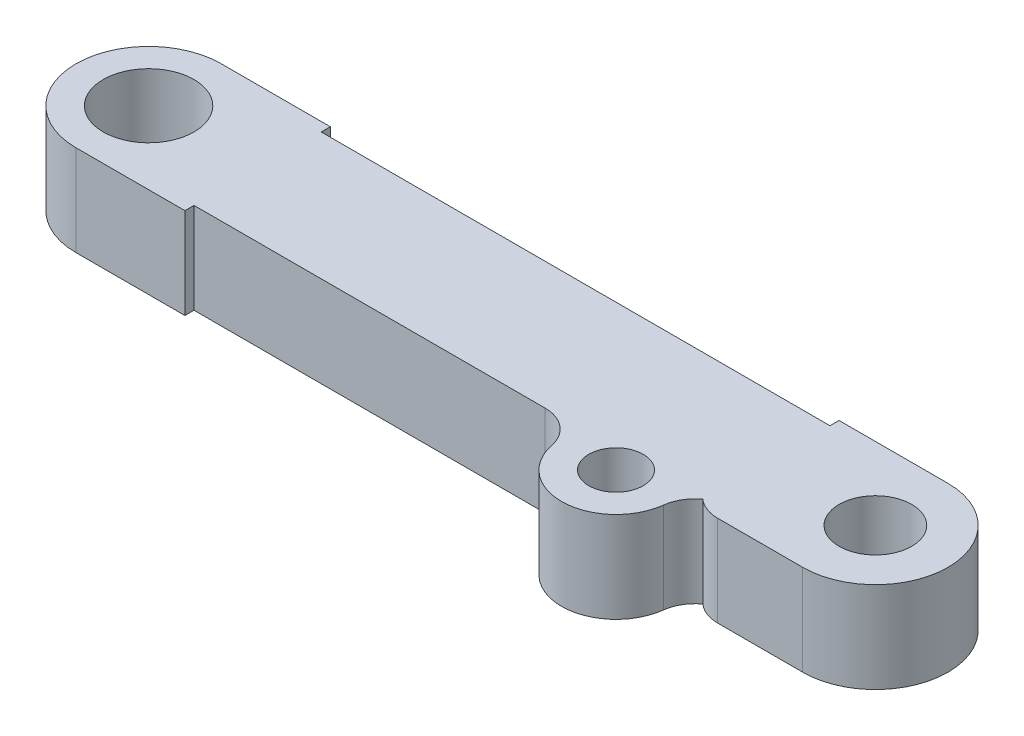
ISO-10303-21;
HEADER;
FILE_DESCRIPTION(('STEP AP214'),'2;1');
FILE_NAME('part.step','',(''),(''),'','','');
FILE_SCHEMA(('AUTOMOTIVE_DESIGN { 1 0 10303 214 1 1 1 1 }'));
ENDSEC;
DATA;
#1=APPLICATION_CONTEXT('core data for automotive mechanical design processes');
#2=APPLICATION_PROTOCOL_DEFINITION('international standard','automotive_design',2000,#1);
#3=PRODUCT_CONTEXT('',#1,'mechanical');
#4=PRODUCT('Part','Part','',(#3));
#5=PRODUCT_RELATED_PRODUCT_CATEGORY('part','',(#4));
#6=PRODUCT_DEFINITION_FORMATION('','',#4);
#7=PRODUCT_DEFINITION_CONTEXT('part definition',#1,'design');
#8=PRODUCT_DEFINITION('design','',#6,#7);
#9=PRODUCT_DEFINITION_SHAPE('','',#8);
#10=(LENGTH_UNIT() NAMED_UNIT(*) SI_UNIT(.MILLI.,.METRE.));
#11=(NAMED_UNIT(*) PLANE_ANGLE_UNIT() SI_UNIT($,.RADIAN.));
#12=(NAMED_UNIT(*) SI_UNIT($,.STERADIAN.) SOLID_ANGLE_UNIT());
#13=UNCERTAINTY_MEASURE_WITH_UNIT(LENGTH_MEASURE(1.E-05),#10,'distance_accuracy_value','');
#14=(GEOMETRIC_REPRESENTATION_CONTEXT(3) GLOBAL_UNCERTAINTY_ASSIGNED_CONTEXT((#13)) GLOBAL_UNIT_ASSIGNED_CONTEXT((#10,
#11,#12)) REPRESENTATION_CONTEXT('',''));
#15=CARTESIAN_POINT('',(0.,0.,0.));
#16=DIRECTION('',(0.,0.,1.));
#17=DIRECTION('',(1.,0.,0.));
#18=AXIS2_PLACEMENT_3D('',#15,#16,#17);
#19=CARTESIAN_POINT('',(0.,100.,0.));
#20=DIRECTION('',(0.,1.,0.));
#21=DIRECTION('',(0.,0.,1.));
#22=AXIS2_PLACEMENT_3D('',#19,#20,#21);
#23=PLANE('',#22);
#24=CARTESIAN_POINT('',(0.,100.,0.));
#25=DIRECTION('',(0.,1.,0.));
#26=DIRECTION('',(0.,0.,1.));
#27=AXIS2_PLACEMENT_3D('',#24,#25,#26);
#28=CIRCLE('',#27,50.);
#29=CARTESIAN_POINT('',(0.,100.,50.));
#30=VERTEX_POINT('',#29);
#31=EDGE_CURVE('E269',#30,#30,#28,.T.);
#32=ORIENTED_EDGE('',*,*,#31,.F.);
#33=EDGE_LOOP('',(#32));
#34=FACE_BOUND('',#33,.T.);
#35=CARTESIAN_POINT('',(703.733155109823,100.,102.198405993668));
#36=DIRECTION('',(0.,1.,0.));
#37=DIRECTION('',(0.,0.,1.));
#38=AXIS2_PLACEMENT_3D('',#35,#36,#37);
#39=CIRCLE('',#38,40.);
#40=CARTESIAN_POINT('',(664.031872730105,100.,97.3190435962007));
#41=VERTEX_POINT('',#40);
#42=CARTESIAN_POINT('',(680.,100.,70.));
#43=VERTEX_POINT('',#42);
#44=EDGE_CURVE('E182',#41,#43,#39,.F.);
#45=ORIENTED_EDGE('',*,*,#44,.T.);
#46=CARTESIAN_POINT('',(706.457513110646,100.,40.));
#47=DIRECTION('',(0.,1.,0.));
#48=DIRECTION('',(0.,0.,1.));
#49=AXIS2_PLACEMENT_3D('',#46,#47,#48);
#50=CIRCLE('',#49,40.);
#51=CARTESIAN_POINT('',(706.457513110646,100.,80.));
#52=VERTEX_POINT('',#51);
#53=EDGE_CURVE('E11',#43,#52,#50,.T.);
#54=ORIENTED_EDGE('',*,*,#53,.T.);
#55=DIRECTION('',(1.,0.,0.));
#56=VECTOR('',#55,1.);
#57=CARTESIAN_POINT('',(680.,100.,80.));
#58=LINE('',#57,#56);
#59=CARTESIAN_POINT('',(800.,100.,80.));
#60=VERTEX_POINT('',#59);
#61=EDGE_CURVE('E257',#52,#60,#58,.T.);
#62=ORIENTED_EDGE('',*,*,#61,.T.);
#63=CARTESIAN_POINT('',(800.,100.,0.));
#64=DIRECTION('',(0.,1.,0.));
#65=DIRECTION('',(0.,0.,1.));
#66=AXIS2_PLACEMENT_3D('',#63,#64,#65);
#67=CIRCLE('',#66,80.);
#68=CARTESIAN_POINT('',(800.,100.,-80.));
#69=VERTEX_POINT('',#68);
#70=EDGE_CURVE('E255',#60,#69,#67,.T.);
#71=ORIENTED_EDGE('',*,*,#70,.T.);
#72=DIRECTION('',(-1.,0.,0.));
#73=VECTOR('',#72,1.);
#74=CARTESIAN_POINT('',(680.,100.,-80.));
#75=LINE('',#74,#73);
#76=CARTESIAN_POINT('',(680.,100.,-80.));
#77=VERTEX_POINT('',#76);
#78=EDGE_CURVE('E253',#69,#77,#75,.T.);
#79=ORIENTED_EDGE('',*,*,#78,.T.);
#80=DIRECTION('',(0.,0.,1.));
#81=VECTOR('',#80,1.);
#82=CARTESIAN_POINT('',(680.,100.,-80.));
#83=LINE('',#82,#81);
#84=CARTESIAN_POINT('',(680.,100.,-70.));
#85=VERTEX_POINT('',#84);
#86=EDGE_CURVE('E251',#77,#85,#83,.T.);
#87=ORIENTED_EDGE('',*,*,#86,.T.);
#88=DIRECTION('',(-1.,0.,0.));
#89=VECTOR('',#88,1.);
#90=CARTESIAN_POINT('',(120.,100.,-70.));
#91=LINE('',#90,#89);
#92=CARTESIAN_POINT('',(120.,100.,-70.));
#93=VERTEX_POINT('',#92);
#94=EDGE_CURVE('E249',#85,#93,#91,.T.);
#95=ORIENTED_EDGE('',*,*,#94,.T.);
#96=DIRECTION('',(0.,0.,-1.));
#97=VECTOR('',#96,1.);
#98=CARTESIAN_POINT('',(120.,100.,-80.));
#99=LINE('',#98,#97);
#100=CARTESIAN_POINT('',(120.,100.,-80.));
#101=VERTEX_POINT('',#100);
#102=EDGE_CURVE('E247',#93,#101,#99,.T.);
#103=ORIENTED_EDGE('',*,*,#102,.T.);
#104=DIRECTION('',(-1.,0.,0.));
#105=VECTOR('',#104,1.);
#106=CARTESIAN_POINT('',(0.,100.,-80.));
#107=LINE('',#106,#105);
#108=CARTESIAN_POINT('',(0.,100.,-80.));
#109=VERTEX_POINT('',#108);
#110=EDGE_CURVE('E155',#101,#109,#107,.T.);
#111=ORIENTED_EDGE('',*,*,#110,.T.);
#112=CARTESIAN_POINT('',(0.,100.,0.));
#113=DIRECTION('',(0.,1.,0.));
#114=DIRECTION('',(0.,0.,1.));
#115=AXIS2_PLACEMENT_3D('',#112,#113,#114);
#116=CIRCLE('',#115,80.);
#117=CARTESIAN_POINT('',(0.,100.,80.));
#118=VERTEX_POINT('',#117);
#119=EDGE_CURVE('E150',#109,#118,#116,.T.);
#120=ORIENTED_EDGE('',*,*,#119,.T.);
#121=DIRECTION('',(1.,0.,0.));
#122=VECTOR('',#121,1.);
#123=CARTESIAN_POINT('',(0.,100.,80.));
#124=LINE('',#123,#122);
#125=CARTESIAN_POINT('',(120.,100.,80.));
#126=VERTEX_POINT('',#125);
#127=EDGE_CURVE('E140',#118,#126,#124,.T.);
#128=ORIENTED_EDGE('',*,*,#127,.T.);
#129=DIRECTION('',(0.,0.,-1.));
#130=VECTOR('',#129,1.);
#131=CARTESIAN_POINT('',(120.,100.,70.));
#132=LINE('',#131,#130);
#133=CARTESIAN_POINT('',(120.,100.,70.));
#134=VERTEX_POINT('',#133);
#135=EDGE_CURVE('E149',#126,#134,#132,.T.);
#136=ORIENTED_EDGE('',*,*,#135,.T.);
#137=DIRECTION('',(1.,0.,0.));
#138=VECTOR('',#137,1.);
#139=CARTESIAN_POINT('',(120.,100.,70.));
#140=LINE('',#139,#138);
#141=CARTESIAN_POINT('',(506.500359449199,100.,70.));
#142=VERTEX_POINT('',#141);
#143=EDGE_CURVE('E262',#134,#142,#140,.T.);
#144=ORIENTED_EDGE('',*,*,#143,.T.);
#145=CARTESIAN_POINT('',(506.500359449199,100.,110.));
#146=DIRECTION('',(0.,1.,0.));
#147=DIRECTION('',(0.,0.,1.));
#148=AXIS2_PLACEMENT_3D('',#145,#146,#147);
#149=CIRCLE('',#148,40.);
#150=CARTESIAN_POINT('',(545.69219533373,100.,102.));
#151=VERTEX_POINT('',#150);
#152=EDGE_CURVE('E176',#142,#151,#149,.F.);
#153=ORIENTED_EDGE('',*,*,#152,.T.);
#154=CARTESIAN_POINT('',(604.479949160526,100.,90.));
#155=DIRECTION('',(0.,1.,0.));
#156=DIRECTION('',(0.,0.,1.));
#157=AXIS2_PLACEMENT_3D('',#154,#155,#156);
#158=CIRCLE('',#157,60.0000000000001);
#159=EDGE_CURVE('E259',#151,#41,#158,.T.);
#160=ORIENTED_EDGE('',*,*,#159,.T.);
#161=EDGE_LOOP('',(#45,#54,#62,#71,#79,#87,#95,#103,#111,#120,#128,#136,#144,#153,#160));
#162=FACE_BOUND('',#161,.T.);
#163=CARTESIAN_POINT('',(604.479949160526,100.,90.));
#164=DIRECTION('',(0.,1.,0.));
#165=DIRECTION('',(0.,0.,1.));
#166=AXIS2_PLACEMENT_3D('',#163,#164,#165);
#167=CIRCLE('',#166,30.);
#168=CARTESIAN_POINT('',(604.479949160526,100.,120.));
#169=VERTEX_POINT('',#168);
#170=EDGE_CURVE('E245',#169,#169,#167,.T.);
#171=ORIENTED_EDGE('',*,*,#170,.F.);
#172=EDGE_LOOP('',(#171));
#173=FACE_BOUND('',#172,.T.);
#174=CARTESIAN_POINT('',(800.,100.,0.));
#175=DIRECTION('',(0.,1.,0.));
#176=DIRECTION('',(0.,0.,1.));
#177=AXIS2_PLACEMENT_3D('',#174,#175,#176);
#178=CIRCLE('',#177,40.);
#179=CARTESIAN_POINT('',(800.,100.,40.));
#180=VERTEX_POINT('',#179);
#181=EDGE_CURVE('E275',#180,#180,#178,.T.);
#182=ORIENTED_EDGE('',*,*,#181,.F.);
#183=EDGE_LOOP('',(#182));
#184=FACE_BOUND('',#183,.T.);
#185=ADVANCED_FACE('F35',(#34,#162,#173,#184),#23,.T.);
#186=CARTESIAN_POINT('',(0.,0.,0.));
#187=DIRECTION('',(0.,1.,0.));
#188=DIRECTION('',(0.,0.,1.));
#189=AXIS2_PLACEMENT_3D('',#186,#187,#188);
#190=PLANE('',#189);
#191=DIRECTION('',(1.,0.,0.));
#192=VECTOR('',#191,1.);
#193=CARTESIAN_POINT('',(680.,0.,80.));
#194=LINE('',#193,#192);
#195=CARTESIAN_POINT('',(706.457513110646,0.,80.));
#196=VERTEX_POINT('',#195);
#197=CARTESIAN_POINT('',(800.,0.,80.));
#198=VERTEX_POINT('',#197);
#199=EDGE_CURVE('E193',#196,#198,#194,.T.);
#200=ORIENTED_EDGE('',*,*,#199,.F.);
#201=CARTESIAN_POINT('',(706.457513110646,0.,40.));
#202=DIRECTION('',(0.,1.,0.));
#203=DIRECTION('',(0.,0.,1.));
#204=AXIS2_PLACEMENT_3D('',#201,#202,#203);
#205=CIRCLE('',#204,40.);
#206=CARTESIAN_POINT('',(680.,0.,70.));
#207=VERTEX_POINT('',#206);
#208=EDGE_CURVE('E43',#196,#207,#205,.F.);
#209=ORIENTED_EDGE('',*,*,#208,.T.);
#210=CARTESIAN_POINT('',(703.733155109823,0.,102.198405993668));
#211=DIRECTION('',(0.,1.,0.));
#212=DIRECTION('',(0.,0.,1.));
#213=AXIS2_PLACEMENT_3D('',#210,#211,#212);
#214=CIRCLE('',#213,40.);
#215=CARTESIAN_POINT('',(664.031872730105,0.,97.3190435962007));
#216=VERTEX_POINT('',#215);
#217=EDGE_CURVE('E180',#207,#216,#214,.T.);
#218=ORIENTED_EDGE('',*,*,#217,.T.);
#219=CARTESIAN_POINT('',(604.479949160526,0.,90.));
#220=DIRECTION('',(0.,1.,0.));
#221=DIRECTION('',(0.,0.,1.));
#222=AXIS2_PLACEMENT_3D('',#219,#220,#221);
#223=CIRCLE('',#222,60.0000000000001);
#224=CARTESIAN_POINT('',(545.69219533373,0.,102.));
#225=VERTEX_POINT('',#224);
#226=EDGE_CURVE('E235',#225,#216,#223,.T.);
#227=ORIENTED_EDGE('',*,*,#226,.F.);
#228=CARTESIAN_POINT('',(506.500359449199,0.,110.));
#229=DIRECTION('',(0.,1.,0.));
#230=DIRECTION('',(0.,0.,1.));
#231=AXIS2_PLACEMENT_3D('',#228,#229,#230);
#232=CIRCLE('',#231,40.);
#233=CARTESIAN_POINT('',(506.500359449199,0.,70.));
#234=VERTEX_POINT('',#233);
#235=EDGE_CURVE('E174',#225,#234,#232,.T.);
#236=ORIENTED_EDGE('',*,*,#235,.T.);
#237=DIRECTION('',(1.,0.,0.));
#238=VECTOR('',#237,1.);
#239=CARTESIAN_POINT('',(120.,0.,70.));
#240=LINE('',#239,#238);
#241=CARTESIAN_POINT('',(120.,0.,70.));
#242=VERTEX_POINT('',#241);
#243=EDGE_CURVE('E237',#242,#234,#240,.T.);
#244=ORIENTED_EDGE('',*,*,#243,.F.);
#245=DIRECTION('',(0.,0.,-1.));
#246=VECTOR('',#245,1.);
#247=CARTESIAN_POINT('',(120.,0.,70.));
#248=LINE('',#247,#246);
#249=CARTESIAN_POINT('',(120.,0.,80.));
#250=VERTEX_POINT('',#249);
#251=EDGE_CURVE('E240',#250,#242,#248,.T.);
#252=ORIENTED_EDGE('',*,*,#251,.F.);
#253=DIRECTION('',(1.,0.,0.));
#254=VECTOR('',#253,1.);
#255=CARTESIAN_POINT('',(0.,0.,80.));
#256=LINE('',#255,#254);
#257=CARTESIAN_POINT('',(0.,0.,80.));
#258=VERTEX_POINT('',#257);
#259=EDGE_CURVE('E242',#258,#250,#256,.T.);
#260=ORIENTED_EDGE('',*,*,#259,.F.);
#261=CARTESIAN_POINT('',(0.,0.,0.));
#262=DIRECTION('',(0.,1.,0.));
#263=DIRECTION('',(0.,0.,1.));
#264=AXIS2_PLACEMENT_3D('',#261,#262,#263);
#265=CIRCLE('',#264,80.);
#266=CARTESIAN_POINT('',(0.,0.,-80.));
#267=VERTEX_POINT('',#266);
#268=EDGE_CURVE('E163',#267,#258,#265,.T.);
#269=ORIENTED_EDGE('',*,*,#268,.F.);
#270=DIRECTION('',(-1.,0.,0.));
#271=VECTOR('',#270,1.);
#272=CARTESIAN_POINT('',(0.,0.,-80.));
#273=LINE('',#272,#271);
#274=CARTESIAN_POINT('',(120.,0.,-80.));
#275=VERTEX_POINT('',#274);
#276=EDGE_CURVE('E159',#275,#267,#273,.T.);
#277=ORIENTED_EDGE('',*,*,#276,.F.);
#278=DIRECTION('',(0.,0.,-1.));
#279=VECTOR('',#278,1.);
#280=CARTESIAN_POINT('',(120.,0.,-80.));
#281=LINE('',#280,#279);
#282=CARTESIAN_POINT('',(120.,0.,-70.));
#283=VERTEX_POINT('',#282);
#284=EDGE_CURVE('E224',#283,#275,#281,.T.);
#285=ORIENTED_EDGE('',*,*,#284,.F.);
#286=DIRECTION('',(-1.,0.,0.));
#287=VECTOR('',#286,1.);
#288=CARTESIAN_POINT('',(120.,0.,-70.));
#289=LINE('',#288,#287);
#290=CARTESIAN_POINT('',(680.,0.,-70.));
#291=VERTEX_POINT('',#290);
#292=EDGE_CURVE('E226',#291,#283,#289,.T.);
#293=ORIENTED_EDGE('',*,*,#292,.F.);
#294=DIRECTION('',(0.,0.,1.));
#295=VECTOR('',#294,1.);
#296=CARTESIAN_POINT('',(680.,0.,-80.));
#297=LINE('',#296,#295);
#298=CARTESIAN_POINT('',(680.,0.,-80.));
#299=VERTEX_POINT('',#298);
#300=EDGE_CURVE('E228',#299,#291,#297,.T.);
#301=ORIENTED_EDGE('',*,*,#300,.F.);
#302=DIRECTION('',(-1.,0.,0.));
#303=VECTOR('',#302,1.);
#304=CARTESIAN_POINT('',(680.,0.,-80.));
#305=LINE('',#304,#303);
#306=CARTESIAN_POINT('',(800.,0.,-80.));
#307=VERTEX_POINT('',#306);
#308=EDGE_CURVE('E230',#307,#299,#305,.T.);
#309=ORIENTED_EDGE('',*,*,#308,.F.);
#310=CARTESIAN_POINT('',(800.,0.,0.));
#311=DIRECTION('',(0.,1.,0.));
#312=DIRECTION('',(0.,0.,1.));
#313=AXIS2_PLACEMENT_3D('',#310,#311,#312);
#314=CIRCLE('',#313,80.);
#315=EDGE_CURVE('E232',#198,#307,#314,.T.);
#316=ORIENTED_EDGE('',*,*,#315,.F.);
#317=EDGE_LOOP('',(#200,#209,#218,#227,#236,#244,#252,#260,#269,#277,#285,#293,#301,#309,#316));
#318=FACE_BOUND('',#317,.T.);
#319=CARTESIAN_POINT('',(604.479949160526,0.,90.));
#320=DIRECTION('',(0.,1.,0.));
#321=DIRECTION('',(0.,0.,1.));
#322=AXIS2_PLACEMENT_3D('',#319,#320,#321);
#323=CIRCLE('',#322,30.);
#324=CARTESIAN_POINT('',(604.479949160526,0.,120.));
#325=VERTEX_POINT('',#324);
#326=EDGE_CURVE('E266',#325,#325,#323,.T.);
#327=ORIENTED_EDGE('',*,*,#326,.T.);
#328=EDGE_LOOP('',(#327));
#329=FACE_BOUND('',#328,.T.);
#330=CARTESIAN_POINT('',(0.,0.,0.));
#331=DIRECTION('',(0.,1.,0.));
#332=DIRECTION('',(0.,0.,1.));
#333=AXIS2_PLACEMENT_3D('',#330,#331,#332);
#334=CIRCLE('',#333,50.);
#335=CARTESIAN_POINT('',(0.,0.,50.));
#336=VERTEX_POINT('',#335);
#337=EDGE_CURVE('E272',#336,#336,#334,.T.);
#338=ORIENTED_EDGE('',*,*,#337,.T.);
#339=EDGE_LOOP('',(#338));
#340=FACE_BOUND('',#339,.T.);
#341=CARTESIAN_POINT('',(800.,0.,0.));
#342=DIRECTION('',(0.,1.,0.));
#343=DIRECTION('',(0.,0.,1.));
#344=AXIS2_PLACEMENT_3D('',#341,#342,#343);
#345=CIRCLE('',#344,40.);
#346=CARTESIAN_POINT('',(800.,0.,40.));
#347=VERTEX_POINT('',#346);
#348=EDGE_CURVE('E278',#347,#347,#345,.T.);
#349=ORIENTED_EDGE('',*,*,#348,.T.);
#350=EDGE_LOOP('',(#349));
#351=FACE_BOUND('',#350,.T.);
#352=ADVANCED_FACE('F188',(#318,#329,#340,#351),#190,.F.);
#353=CARTESIAN_POINT('',(0.,100.,0.));
#354=DIRECTION('',(0.,-1.,0.));
#355=DIRECTION('',(0.,0.,-1.));
#356=AXIS2_PLACEMENT_3D('',#353,#354,#355);
#357=CYLINDRICAL_SURFACE('',#356,80.);
#358=ORIENTED_EDGE('',*,*,#268,.T.);
#359=DIRECTION('',(0.,-1.,0.));
#360=VECTOR('',#359,1.);
#361=CARTESIAN_POINT('',(0.,100.,80.));
#362=LINE('',#361,#360);
#363=EDGE_CURVE('E144',#118,#258,#362,.T.);
#364=ORIENTED_EDGE('',*,*,#363,.F.);
#365=ORIENTED_EDGE('',*,*,#119,.F.);
#366=DIRECTION('',(0.,-1.,0.));
#367=VECTOR('',#366,1.);
#368=CARTESIAN_POINT('',(0.,100.,-80.));
#369=LINE('',#368,#367);
#370=EDGE_CURVE('E221',#109,#267,#369,.T.);
#371=ORIENTED_EDGE('',*,*,#370,.T.);
#372=EDGE_LOOP('',(#358,#364,#365,#371));
#373=FACE_BOUND('',#372,.T.);
#374=ADVANCED_FACE('F161',(#373),#357,.T.);
#375=CARTESIAN_POINT('',(0.,100.,80.));
#376=DIRECTION('',(0.,0.,-1.));
#377=DIRECTION('',(-1.,0.,0.));
#378=AXIS2_PLACEMENT_3D('',#375,#376,#377);
#379=PLANE('',#378);
#380=ORIENTED_EDGE('',*,*,#259,.T.);
#381=DIRECTION('',(0.,-1.,0.));
#382=VECTOR('',#381,1.);
#383=CARTESIAN_POINT('',(120.,100.,80.));
#384=LINE('',#383,#382);
#385=EDGE_CURVE('E147',#126,#250,#384,.T.);
#386=ORIENTED_EDGE('',*,*,#385,.F.);
#387=ORIENTED_EDGE('',*,*,#127,.F.);
#388=ORIENTED_EDGE('',*,*,#363,.T.);
#389=EDGE_LOOP('',(#380,#386,#387,#388));
#390=FACE_BOUND('',#389,.T.);
#391=ADVANCED_FACE('F142',(#390),#379,.F.);
#392=CARTESIAN_POINT('',(120.,100.,70.));
#393=DIRECTION('',(-1.,0.,0.));
#394=DIRECTION('',(0.,0.,1.));
#395=AXIS2_PLACEMENT_3D('',#392,#393,#394);
#396=PLANE('',#395);
#397=ORIENTED_EDGE('',*,*,#251,.T.);
#398=DIRECTION('',(0.,-1.,0.));
#399=VECTOR('',#398,1.);
#400=CARTESIAN_POINT('',(120.,100.,70.));
#401=LINE('',#400,#399);
#402=EDGE_CURVE('E169',#134,#242,#401,.T.);
#403=ORIENTED_EDGE('',*,*,#402,.F.);
#404=ORIENTED_EDGE('',*,*,#135,.F.);
#405=ORIENTED_EDGE('',*,*,#385,.T.);
#406=EDGE_LOOP('',(#397,#403,#404,#405));
#407=FACE_BOUND('',#406,.T.);
#408=ADVANCED_FACE('F334',(#407),#396,.F.);
#409=CARTESIAN_POINT('',(120.,100.,70.));
#410=DIRECTION('',(0.,0.,-1.));
#411=DIRECTION('',(-1.,0.,0.));
#412=AXIS2_PLACEMENT_3D('',#409,#410,#411);
#413=PLANE('',#412);
#414=ORIENTED_EDGE('',*,*,#243,.T.);
#415=DIRECTION('',(0.,1.,0.));
#416=VECTOR('',#415,1.);
#417=CARTESIAN_POINT('',(506.500359449199,100.,70.));
#418=LINE('',#417,#416);
#419=EDGE_CURVE('E167',#234,#142,#418,.T.);
#420=ORIENTED_EDGE('',*,*,#419,.T.);
#421=ORIENTED_EDGE('',*,*,#143,.F.);
#422=ORIENTED_EDGE('',*,*,#402,.T.);
#423=EDGE_LOOP('',(#414,#420,#421,#422));
#424=FACE_BOUND('',#423,.T.);
#425=ADVANCED_FACE('F330',(#424),#413,.F.);
#426=CARTESIAN_POINT('',(604.479949160526,100.,90.));
#427=DIRECTION('',(0.,-1.,0.));
#428=DIRECTION('',(0.,0.,-1.));
#429=AXIS2_PLACEMENT_3D('',#426,#427,#428);
#430=CYLINDRICAL_SURFACE('',#429,60.0000000000001);
#431=ORIENTED_EDGE('',*,*,#226,.T.);
#432=DIRECTION('',(0.,-1.,0.));
#433=VECTOR('',#432,1.);
#434=CARTESIAN_POINT('',(664.031872730105,100.,97.3190435962007));
#435=LINE('',#434,#433);
#436=EDGE_CURVE('E178',#216,#41,#435,.F.);
#437=ORIENTED_EDGE('',*,*,#436,.T.);
#438=ORIENTED_EDGE('',*,*,#159,.F.);
#439=DIRECTION('',(0.,-1.,0.));
#440=VECTOR('',#439,1.);
#441=CARTESIAN_POINT('',(545.69219533373,100.,102.));
#442=LINE('',#441,#440);
#443=EDGE_CURVE('E164',#151,#225,#442,.T.);
#444=ORIENTED_EDGE('',*,*,#443,.T.);
#445=EDGE_LOOP('',(#431,#437,#438,#444));
#446=FACE_BOUND('',#445,.T.);
#447=ADVANCED_FACE('F326',(#446),#430,.T.);
#448=CARTESIAN_POINT('',(680.,100.,80.));
#449=DIRECTION('',(0.,0.,-1.));
#450=DIRECTION('',(-1.,0.,0.));
#451=AXIS2_PLACEMENT_3D('',#448,#449,#450);
#452=PLANE('',#451);
#453=ORIENTED_EDGE('',*,*,#61,.F.);
#454=DIRECTION('',(0.,1.,0.));
#455=VECTOR('',#454,1.);
#456=CARTESIAN_POINT('',(706.457513110646,100.,80.));
#457=LINE('',#456,#455);
#458=EDGE_CURVE('E184',#52,#196,#457,.F.);
#459=ORIENTED_EDGE('',*,*,#458,.T.);
#460=ORIENTED_EDGE('',*,*,#199,.T.);
#461=DIRECTION('',(0.,-1.,0.));
#462=VECTOR('',#461,1.);
#463=CARTESIAN_POINT('',(800.,100.,80.));
#464=LINE('',#463,#462);
#465=EDGE_CURVE('E200',#60,#198,#464,.T.);
#466=ORIENTED_EDGE('',*,*,#465,.F.);
#467=EDGE_LOOP('',(#453,#459,#460,#466));
#468=FACE_BOUND('',#467,.T.);
#469=ADVANCED_FACE('F322',(#468),#452,.F.);
#470=CARTESIAN_POINT('',(800.,100.,0.));
#471=DIRECTION('',(0.,-1.,0.));
#472=DIRECTION('',(0.,0.,-1.));
#473=AXIS2_PLACEMENT_3D('',#470,#471,#472);
#474=CYLINDRICAL_SURFACE('',#473,80.);
#475=ORIENTED_EDGE('',*,*,#315,.T.);
#476=DIRECTION('',(0.,-1.,0.));
#477=VECTOR('',#476,1.);
#478=CARTESIAN_POINT('',(800.,100.,-80.));
#479=LINE('',#478,#477);
#480=EDGE_CURVE('E204',#69,#307,#479,.T.);
#481=ORIENTED_EDGE('',*,*,#480,.F.);
#482=ORIENTED_EDGE('',*,*,#70,.F.);
#483=ORIENTED_EDGE('',*,*,#465,.T.);
#484=EDGE_LOOP('',(#475,#481,#482,#483));
#485=FACE_BOUND('',#484,.T.);
#486=ADVANCED_FACE('F318',(#485),#474,.T.);
#487=CARTESIAN_POINT('',(680.,100.,-80.));
#488=DIRECTION('',(0.,0.,1.));
#489=DIRECTION('',(1.,0.,0.));
#490=AXIS2_PLACEMENT_3D('',#487,#488,#489);
#491=PLANE('',#490);
#492=ORIENTED_EDGE('',*,*,#308,.T.);
#493=DIRECTION('',(0.,-1.,0.));
#494=VECTOR('',#493,1.);
#495=CARTESIAN_POINT('',(680.,100.,-80.));
#496=LINE('',#495,#494);
#497=EDGE_CURVE('E209',#77,#299,#496,.T.);
#498=ORIENTED_EDGE('',*,*,#497,.F.);
#499=ORIENTED_EDGE('',*,*,#78,.F.);
#500=ORIENTED_EDGE('',*,*,#480,.T.);
#501=EDGE_LOOP('',(#492,#498,#499,#500));
#502=FACE_BOUND('',#501,.T.);
#503=ADVANCED_FACE('F314',(#502),#491,.F.);
#504=CARTESIAN_POINT('',(680.,100.,-80.));
#505=DIRECTION('',(1.,0.,0.));
#506=DIRECTION('',(0.,0.,-1.));
#507=AXIS2_PLACEMENT_3D('',#504,#505,#506);
#508=PLANE('',#507);
#509=ORIENTED_EDGE('',*,*,#300,.T.);
#510=DIRECTION('',(0.,-1.,0.));
#511=VECTOR('',#510,1.);
#512=CARTESIAN_POINT('',(680.,100.,-70.));
#513=LINE('',#512,#511);
#514=EDGE_CURVE('E212',#85,#291,#513,.T.);
#515=ORIENTED_EDGE('',*,*,#514,.F.);
#516=ORIENTED_EDGE('',*,*,#86,.F.);
#517=ORIENTED_EDGE('',*,*,#497,.T.);
#518=EDGE_LOOP('',(#509,#515,#516,#517));
#519=FACE_BOUND('',#518,.T.);
#520=ADVANCED_FACE('F310',(#519),#508,.F.);
#521=CARTESIAN_POINT('',(120.,100.,-70.));
#522=DIRECTION('',(0.,0.,1.));
#523=DIRECTION('',(1.,0.,0.));
#524=AXIS2_PLACEMENT_3D('',#521,#522,#523);
#525=PLANE('',#524);
#526=ORIENTED_EDGE('',*,*,#292,.T.);
#527=DIRECTION('',(0.,-1.,0.));
#528=VECTOR('',#527,1.);
#529=CARTESIAN_POINT('',(120.,100.,-70.));
#530=LINE('',#529,#528);
#531=EDGE_CURVE('E215',#93,#283,#530,.T.);
#532=ORIENTED_EDGE('',*,*,#531,.F.);
#533=ORIENTED_EDGE('',*,*,#94,.F.);
#534=ORIENTED_EDGE('',*,*,#514,.T.);
#535=EDGE_LOOP('',(#526,#532,#533,#534));
#536=FACE_BOUND('',#535,.T.);
#537=ADVANCED_FACE('F306',(#536),#525,.F.);
#538=CARTESIAN_POINT('',(120.,100.,-80.));
#539=DIRECTION('',(-1.,0.,0.));
#540=DIRECTION('',(0.,0.,1.));
#541=AXIS2_PLACEMENT_3D('',#538,#539,#540);
#542=PLANE('',#541);
#543=ORIENTED_EDGE('',*,*,#284,.T.);
#544=DIRECTION('',(0.,-1.,0.));
#545=VECTOR('',#544,1.);
#546=CARTESIAN_POINT('',(120.,100.,-80.));
#547=LINE('',#546,#545);
#548=EDGE_CURVE('E218',#101,#275,#547,.T.);
#549=ORIENTED_EDGE('',*,*,#548,.F.);
#550=ORIENTED_EDGE('',*,*,#102,.F.);
#551=ORIENTED_EDGE('',*,*,#531,.T.);
#552=EDGE_LOOP('',(#543,#549,#550,#551));
#553=FACE_BOUND('',#552,.T.);
#554=ADVANCED_FACE('F302',(#553),#542,.F.);
#555=CARTESIAN_POINT('',(0.,100.,-80.));
#556=DIRECTION('',(0.,0.,1.));
#557=DIRECTION('',(1.,0.,0.));
#558=AXIS2_PLACEMENT_3D('',#555,#556,#557);
#559=PLANE('',#558);
#560=ORIENTED_EDGE('',*,*,#276,.T.);
#561=ORIENTED_EDGE('',*,*,#370,.F.);
#562=ORIENTED_EDGE('',*,*,#110,.F.);
#563=ORIENTED_EDGE('',*,*,#548,.T.);
#564=EDGE_LOOP('',(#560,#561,#562,#563));
#565=FACE_BOUND('',#564,.T.);
#566=ADVANCED_FACE('F299',(#565),#559,.F.);
#567=CARTESIAN_POINT('',(604.479949160526,100.,90.));
#568=DIRECTION('',(0.,-1.,0.));
#569=DIRECTION('',(0.,0.,-1.));
#570=AXIS2_PLACEMENT_3D('',#567,#568,#569);
#571=CYLINDRICAL_SURFACE('',#570,30.);
#572=ORIENTED_EDGE('',*,*,#170,.T.);
#573=EDGE_LOOP('',(#572));
#574=FACE_BOUND('',#573,.T.);
#575=ORIENTED_EDGE('',*,*,#326,.F.);
#576=EDGE_LOOP('',(#575));
#577=FACE_BOUND('',#576,.T.);
#578=ADVANCED_FACE('F296',(#574,#577),#571,.F.);
#579=CARTESIAN_POINT('',(0.,100.,0.));
#580=DIRECTION('',(0.,-1.,0.));
#581=DIRECTION('',(0.,0.,-1.));
#582=AXIS2_PLACEMENT_3D('',#579,#580,#581);
#583=CYLINDRICAL_SURFACE('',#582,50.);
#584=ORIENTED_EDGE('',*,*,#31,.T.);
#585=EDGE_LOOP('',(#584));
#586=FACE_BOUND('',#585,.T.);
#587=ORIENTED_EDGE('',*,*,#337,.F.);
#588=EDGE_LOOP('',(#587));
#589=FACE_BOUND('',#588,.T.);
#590=ADVANCED_FACE('F402',(#586,#589),#583,.F.);
#591=CARTESIAN_POINT('',(800.,100.,0.));
#592=DIRECTION('',(0.,-1.,0.));
#593=DIRECTION('',(0.,0.,-1.));
#594=AXIS2_PLACEMENT_3D('',#591,#592,#593);
#595=CYLINDRICAL_SURFACE('',#594,40.);
#596=ORIENTED_EDGE('',*,*,#181,.T.);
#597=EDGE_LOOP('',(#596));
#598=FACE_BOUND('',#597,.T.);
#599=ORIENTED_EDGE('',*,*,#348,.F.);
#600=EDGE_LOOP('',(#599));
#601=FACE_BOUND('',#600,.T.);
#602=ADVANCED_FACE('F284',(#598,#601),#595,.F.);
#603=CARTESIAN_POINT('',(506.500359449199,100.,110.));
#604=DIRECTION('',(0.,-1.,0.));
#605=DIRECTION('',(0.,0.,-1.));
#606=AXIS2_PLACEMENT_3D('',#603,#604,#605);
#607=CYLINDRICAL_SURFACE('',#606,40.);
#608=ORIENTED_EDGE('',*,*,#152,.F.);
#609=ORIENTED_EDGE('',*,*,#419,.F.);
#610=ORIENTED_EDGE('',*,*,#235,.F.);
#611=ORIENTED_EDGE('',*,*,#443,.F.);
#612=EDGE_LOOP('',(#608,#609,#610,#611));
#613=FACE_BOUND('',#612,.T.);
#614=ADVANCED_FACE('F343',(#613),#607,.F.);
#615=CARTESIAN_POINT('',(703.733155109823,100.,102.198405993668));
#616=DIRECTION('',(0.,1.,0.));
#617=DIRECTION('',(0.,0.,1.));
#618=AXIS2_PLACEMENT_3D('',#615,#616,#617);
#619=CYLINDRICAL_SURFACE('',#618,40.);
#620=ORIENTED_EDGE('',*,*,#44,.F.);
#621=ORIENTED_EDGE('',*,*,#436,.F.);
#622=ORIENTED_EDGE('',*,*,#217,.F.);
#623=DIRECTION('',(0.,-1.,0.));
#624=VECTOR('',#623,1.);
#625=CARTESIAN_POINT('',(680.,100.,70.));
#626=LINE('',#625,#624);
#627=EDGE_CURVE('E199',#43,#207,#626,.T.);
#628=ORIENTED_EDGE('',*,*,#627,.F.);
#629=EDGE_LOOP('',(#620,#621,#622,#628));
#630=FACE_BOUND('',#629,.T.);
#631=ADVANCED_FACE('F198',(#630),#619,.F.);
#632=CARTESIAN_POINT('',(706.457513110646,100.,40.));
#633=DIRECTION('',(0.,1.,0.));
#634=DIRECTION('',(0.,0.,1.));
#635=AXIS2_PLACEMENT_3D('',#632,#633,#634);
#636=CYLINDRICAL_SURFACE('',#635,40.);
#637=ORIENTED_EDGE('',*,*,#53,.F.);
#638=ORIENTED_EDGE('',*,*,#627,.T.);
#639=ORIENTED_EDGE('',*,*,#208,.F.);
#640=ORIENTED_EDGE('',*,*,#458,.F.);
#641=EDGE_LOOP('',(#637,#638,#639,#640));
#642=FACE_BOUND('',#641,.T.);
#643=ADVANCED_FACE('F37',(#642),#636,.T.);
#644=CLOSED_SHELL('',(#185,#352,#374,#391,#408,#425,#447,#469,#486,#503,#520,#537,#554,#566,
#578,#590,#602,#614,#631,#643));
#645=MANIFOLD_SOLID_BREP('B2',#644);
#646=ADVANCED_BREP_SHAPE_REPRESENTATION('',(#18,#645),#14);
#647=SHAPE_DEFINITION_REPRESENTATION(#9,#646);
ENDSEC;
END-ISO-10303-21;
